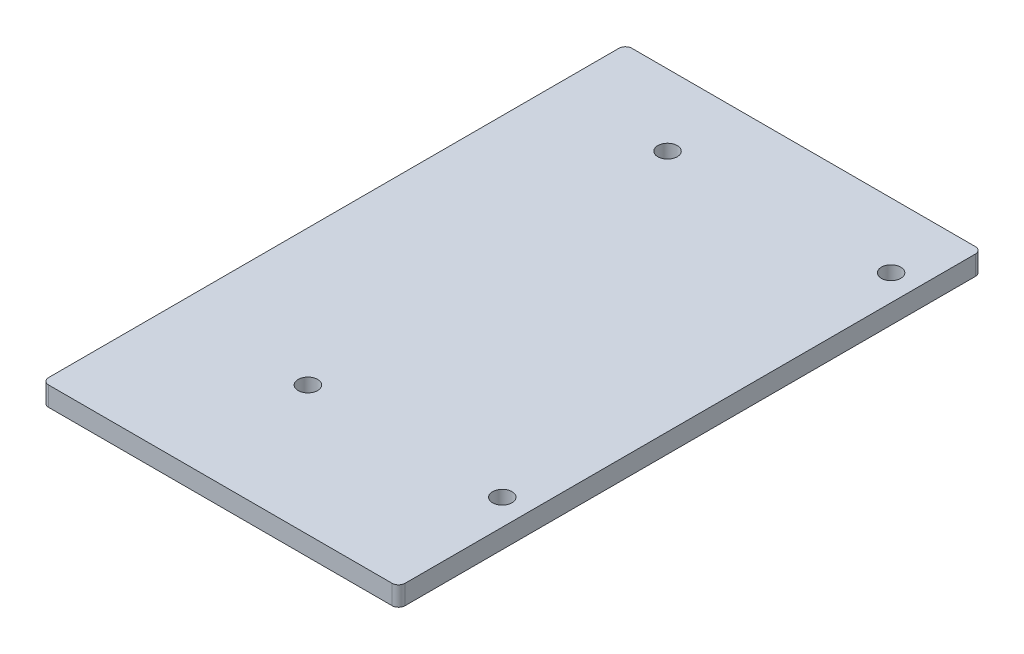
ISO-10303-21;
HEADER;
FILE_DESCRIPTION(('STEP AP214'),'2;1');
FILE_NAME('part.step','',(''),(''),'','','');
FILE_SCHEMA(('AUTOMOTIVE_DESIGN { 1 0 10303 214 1 1 1 1 }'));
ENDSEC;
DATA;
#1=APPLICATION_CONTEXT('core data for automotive mechanical design processes');
#2=APPLICATION_PROTOCOL_DEFINITION('international standard','automotive_design',2000,#1);
#3=PRODUCT_CONTEXT('',#1,'mechanical');
#4=PRODUCT('Part','Part','',(#3));
#5=PRODUCT_RELATED_PRODUCT_CATEGORY('part','',(#4));
#6=PRODUCT_DEFINITION_FORMATION('','',#4);
#7=PRODUCT_DEFINITION_CONTEXT('part definition',#1,'design');
#8=PRODUCT_DEFINITION('design','',#6,#7);
#9=PRODUCT_DEFINITION_SHAPE('','',#8);
#10=(LENGTH_UNIT() NAMED_UNIT(*) SI_UNIT(.MILLI.,.METRE.));
#11=(NAMED_UNIT(*) PLANE_ANGLE_UNIT() SI_UNIT($,.RADIAN.));
#12=(NAMED_UNIT(*) SI_UNIT($,.STERADIAN.) SOLID_ANGLE_UNIT());
#13=UNCERTAINTY_MEASURE_WITH_UNIT(LENGTH_MEASURE(1.E-05),#10,'distance_accuracy_value','');
#14=(GEOMETRIC_REPRESENTATION_CONTEXT(3) GLOBAL_UNCERTAINTY_ASSIGNED_CONTEXT((#13)) GLOBAL_UNIT_ASSIGNED_CONTEXT((#10,
#11,#12)) REPRESENTATION_CONTEXT('',''));
#15=CARTESIAN_POINT('',(0.,0.,0.));
#16=DIRECTION('',(0.,0.,1.));
#17=DIRECTION('',(1.,0.,0.));
#18=AXIS2_PLACEMENT_3D('',#15,#16,#17);
#19=CARTESIAN_POINT('',(0.,3.,0.));
#20=DIRECTION('',(0.,1.,0.));
#21=DIRECTION('',(0.,0.,1.));
#22=AXIS2_PLACEMENT_3D('',#19,#20,#21);
#23=PLANE('',#22);
#24=CARTESIAN_POINT('',(21.,3.,70.));
#25=DIRECTION('',(0.,1.,0.));
#26=DIRECTION('',(0.,0.,1.));
#27=AXIS2_PLACEMENT_3D('',#24,#25,#26);
#28=CIRCLE('',#27,1.5);
#29=CARTESIAN_POINT('',(21.,3.,71.5));
#30=VERTEX_POINT('',#29);
#31=EDGE_CURVE('E189',#30,#30,#28,.T.);
#32=ORIENTED_EDGE('',*,*,#31,.F.);
#33=EDGE_LOOP('',(#32));
#34=FACE_BOUND('',#33,.T.);
#35=CARTESIAN_POINT('',(17.5,3.,11.));
#36=DIRECTION('',(0.,1.,0.));
#37=DIRECTION('',(0.,0.,1.));
#38=AXIS2_PLACEMENT_3D('',#35,#36,#37);
#39=CIRCLE('',#38,1.5);
#40=CARTESIAN_POINT('',(17.5,3.,12.5));
#41=VERTEX_POINT('',#40);
#42=EDGE_CURVE('E172',#41,#41,#39,.T.);
#43=ORIENTED_EDGE('',*,*,#42,.F.);
#44=EDGE_LOOP('',(#43));
#45=FACE_BOUND('',#44,.T.);
#46=DIRECTION('',(0.,0.,-1.));
#47=VECTOR('',#46,1.);
#48=CARTESIAN_POINT('',(55.,3.,0.));
#49=LINE('',#48,#47);
#50=CARTESIAN_POINT('',(55.,3.,89.));
#51=VERTEX_POINT('',#50);
#52=CARTESIAN_POINT('',(55.,3.,0.999999999999999));
#53=VERTEX_POINT('',#52);
#54=EDGE_CURVE('E179',#51,#53,#49,.T.);
#55=ORIENTED_EDGE('',*,*,#54,.T.);
#56=CARTESIAN_POINT('',(54.,3.,1.));
#57=DIRECTION('',(0.,1.,0.));
#58=DIRECTION('',(0.,0.,1.));
#59=AXIS2_PLACEMENT_3D('',#56,#57,#58);
#60=CIRCLE('',#59,1.);
#61=CARTESIAN_POINT('',(54.,3.,0.));
#62=VERTEX_POINT('',#61);
#63=EDGE_CURVE('E156',#53,#62,#60,.T.);
#64=ORIENTED_EDGE('',*,*,#63,.T.);
#65=DIRECTION('',(-1.,0.,0.));
#66=VECTOR('',#65,1.);
#67=CARTESIAN_POINT('',(0.,3.,0.));
#68=LINE('',#67,#66);
#69=CARTESIAN_POINT('',(1.,3.,0.));
#70=VERTEX_POINT('',#69);
#71=EDGE_CURVE('E127',#62,#70,#68,.T.);
#72=ORIENTED_EDGE('',*,*,#71,.T.);
#73=CARTESIAN_POINT('',(1.,3.,1.));
#74=DIRECTION('',(0.,1.,0.));
#75=DIRECTION('',(0.,0.,1.));
#76=AXIS2_PLACEMENT_3D('',#73,#74,#75);
#77=CIRCLE('',#76,1.);
#78=CARTESIAN_POINT('',(0.,3.,1.));
#79=VERTEX_POINT('',#78);
#80=EDGE_CURVE('E154',#70,#79,#77,.T.);
#81=ORIENTED_EDGE('',*,*,#80,.T.);
#82=DIRECTION('',(0.,0.,1.));
#83=VECTOR('',#82,1.);
#84=CARTESIAN_POINT('',(0.,3.,0.));
#85=LINE('',#84,#83);
#86=CARTESIAN_POINT('',(0.,3.,89.));
#87=VERTEX_POINT('',#86);
#88=EDGE_CURVE('E134',#79,#87,#85,.T.);
#89=ORIENTED_EDGE('',*,*,#88,.T.);
#90=CARTESIAN_POINT('',(1.00000000000001,3.,89.));
#91=DIRECTION('',(0.,1.,0.));
#92=DIRECTION('',(0.,0.,1.));
#93=AXIS2_PLACEMENT_3D('',#90,#91,#92);
#94=CIRCLE('',#93,1.);
#95=CARTESIAN_POINT('',(1.00000000000001,3.,90.));
#96=VERTEX_POINT('',#95);
#97=EDGE_CURVE('E62',#87,#96,#94,.T.);
#98=ORIENTED_EDGE('',*,*,#97,.T.);
#99=DIRECTION('',(1.,0.,0.));
#100=VECTOR('',#99,1.);
#101=CARTESIAN_POINT('',(0.,3.,90.));
#102=LINE('',#101,#100);
#103=CARTESIAN_POINT('',(54.,3.,90.));
#104=VERTEX_POINT('',#103);
#105=EDGE_CURVE('E137',#96,#104,#102,.T.);
#106=ORIENTED_EDGE('',*,*,#105,.T.);
#107=CARTESIAN_POINT('',(54.,3.,89.));
#108=DIRECTION('',(0.,1.,0.));
#109=DIRECTION('',(0.,0.,1.));
#110=AXIS2_PLACEMENT_3D('',#107,#108,#109);
#111=CIRCLE('',#110,1.);
#112=EDGE_CURVE('E151',#104,#51,#111,.T.);
#113=ORIENTED_EDGE('',*,*,#112,.T.);
#114=EDGE_LOOP('',(#55,#64,#72,#81,#89,#98,#106,#113));
#115=FACE_BOUND('',#114,.T.);
#116=CARTESIAN_POINT('',(51.,3.,10.));
#117=DIRECTION('',(0.,1.,0.));
#118=DIRECTION('',(0.,0.,1.));
#119=AXIS2_PLACEMENT_3D('',#116,#117,#118);
#120=CIRCLE('',#119,1.5);
#121=CARTESIAN_POINT('',(51.,3.,11.5));
#122=VERTEX_POINT('',#121);
#123=EDGE_CURVE('E184',#122,#122,#120,.T.);
#124=ORIENTED_EDGE('',*,*,#123,.F.);
#125=EDGE_LOOP('',(#124));
#126=FACE_BOUND('',#125,.T.);
#127=CARTESIAN_POINT('',(51.,3.,70.));
#128=DIRECTION('',(0.,1.,0.));
#129=DIRECTION('',(0.,0.,1.));
#130=AXIS2_PLACEMENT_3D('',#127,#128,#129);
#131=CIRCLE('',#130,1.5);
#132=CARTESIAN_POINT('',(51.,3.,71.5));
#133=VERTEX_POINT('',#132);
#134=EDGE_CURVE('E195',#133,#133,#131,.T.);
#135=ORIENTED_EDGE('',*,*,#134,.F.);
#136=EDGE_LOOP('',(#135));
#137=FACE_BOUND('',#136,.T.);
#138=ADVANCED_FACE('F41',(#34,#45,#115,#126,#137),#23,.T.);
#139=CARTESIAN_POINT('',(0.,0.,0.));
#140=DIRECTION('',(0.,1.,0.));
#141=DIRECTION('',(0.,0.,1.));
#142=AXIS2_PLACEMENT_3D('',#139,#140,#141);
#143=PLANE('',#142);
#144=DIRECTION('',(-1.,0.,0.));
#145=VECTOR('',#144,1.);
#146=CARTESIAN_POINT('',(0.,0.,0.));
#147=LINE('',#146,#145);
#148=CARTESIAN_POINT('',(54.,0.,0.));
#149=VERTEX_POINT('',#148);
#150=CARTESIAN_POINT('',(1.,0.,0.));
#151=VERTEX_POINT('',#150);
#152=EDGE_CURVE('E124',#149,#151,#147,.T.);
#153=ORIENTED_EDGE('',*,*,#152,.F.);
#154=CARTESIAN_POINT('',(54.,0.,1.));
#155=DIRECTION('',(0.,1.,0.));
#156=DIRECTION('',(0.,0.,1.));
#157=AXIS2_PLACEMENT_3D('',#154,#155,#156);
#158=CIRCLE('',#157,1.);
#159=CARTESIAN_POINT('',(55.,0.,0.999999999999999));
#160=VERTEX_POINT('',#159);
#161=EDGE_CURVE('E107',#149,#160,#158,.F.);
#162=ORIENTED_EDGE('',*,*,#161,.T.);
#163=DIRECTION('',(0.,0.,-1.));
#164=VECTOR('',#163,1.);
#165=CARTESIAN_POINT('',(55.,0.,0.));
#166=LINE('',#165,#164);
#167=CARTESIAN_POINT('',(55.,0.,89.));
#168=VERTEX_POINT('',#167);
#169=EDGE_CURVE('E135',#168,#160,#166,.T.);
#170=ORIENTED_EDGE('',*,*,#169,.F.);
#171=CARTESIAN_POINT('',(54.,0.,89.));
#172=DIRECTION('',(0.,1.,0.));
#173=DIRECTION('',(0.,0.,1.));
#174=AXIS2_PLACEMENT_3D('',#171,#172,#173);
#175=CIRCLE('',#174,1.);
#176=CARTESIAN_POINT('',(54.,0.,90.));
#177=VERTEX_POINT('',#176);
#178=EDGE_CURVE('E128',#168,#177,#175,.F.);
#179=ORIENTED_EDGE('',*,*,#178,.T.);
#180=DIRECTION('',(1.,0.,0.));
#181=VECTOR('',#180,1.);
#182=CARTESIAN_POINT('',(0.,0.,90.));
#183=LINE('',#182,#181);
#184=CARTESIAN_POINT('',(1.00000000000001,0.,90.));
#185=VERTEX_POINT('',#184);
#186=EDGE_CURVE('E139',#185,#177,#183,.T.);
#187=ORIENTED_EDGE('',*,*,#186,.F.);
#188=CARTESIAN_POINT('',(1.00000000000001,0.,89.));
#189=DIRECTION('',(0.,1.,0.));
#190=DIRECTION('',(0.,0.,1.));
#191=AXIS2_PLACEMENT_3D('',#188,#189,#190);
#192=CIRCLE('',#191,1.);
#193=CARTESIAN_POINT('',(0.,0.,89.));
#194=VERTEX_POINT('',#193);
#195=EDGE_CURVE('E145',#185,#194,#192,.F.);
#196=ORIENTED_EDGE('',*,*,#195,.T.);
#197=DIRECTION('',(0.,0.,1.));
#198=VECTOR('',#197,1.);
#199=CARTESIAN_POINT('',(0.,0.,0.));
#200=LINE('',#199,#198);
#201=CARTESIAN_POINT('',(0.,0.,1.));
#202=VERTEX_POINT('',#201);
#203=EDGE_CURVE('E167',#202,#194,#200,.T.);
#204=ORIENTED_EDGE('',*,*,#203,.F.);
#205=CARTESIAN_POINT('',(1.,0.,1.));
#206=DIRECTION('',(0.,1.,0.));
#207=DIRECTION('',(0.,0.,1.));
#208=AXIS2_PLACEMENT_3D('',#205,#206,#207);
#209=CIRCLE('',#208,1.);
#210=EDGE_CURVE('E118',#202,#151,#209,.F.);
#211=ORIENTED_EDGE('',*,*,#210,.T.);
#212=EDGE_LOOP('',(#153,#162,#170,#179,#187,#196,#204,#211));
#213=FACE_BOUND('',#212,.T.);
#214=CARTESIAN_POINT('',(17.5,0.,11.));
#215=DIRECTION('',(0.,1.,0.));
#216=DIRECTION('',(0.,0.,1.));
#217=AXIS2_PLACEMENT_3D('',#214,#215,#216);
#218=CIRCLE('',#217,1.5);
#219=CARTESIAN_POINT('',(17.5,0.,12.5));
#220=VERTEX_POINT('',#219);
#221=EDGE_CURVE('E175',#220,#220,#218,.T.);
#222=ORIENTED_EDGE('',*,*,#221,.T.);
#223=EDGE_LOOP('',(#222));
#224=FACE_BOUND('',#223,.T.);
#225=CARTESIAN_POINT('',(51.,0.,10.));
#226=DIRECTION('',(0.,1.,0.));
#227=DIRECTION('',(0.,0.,1.));
#228=AXIS2_PLACEMENT_3D('',#225,#226,#227);
#229=CIRCLE('',#228,1.5);
#230=CARTESIAN_POINT('',(51.,0.,11.5));
#231=VERTEX_POINT('',#230);
#232=EDGE_CURVE('E186',#231,#231,#229,.T.);
#233=ORIENTED_EDGE('',*,*,#232,.T.);
#234=EDGE_LOOP('',(#233));
#235=FACE_BOUND('',#234,.T.);
#236=CARTESIAN_POINT('',(21.,0.,70.));
#237=DIRECTION('',(0.,1.,0.));
#238=DIRECTION('',(0.,0.,1.));
#239=AXIS2_PLACEMENT_3D('',#236,#237,#238);
#240=CIRCLE('',#239,1.5);
#241=CARTESIAN_POINT('',(21.,0.,71.5));
#242=VERTEX_POINT('',#241);
#243=EDGE_CURVE('E192',#242,#242,#240,.T.);
#244=ORIENTED_EDGE('',*,*,#243,.T.);
#245=EDGE_LOOP('',(#244));
#246=FACE_BOUND('',#245,.T.);
#247=CARTESIAN_POINT('',(51.,0.,70.));
#248=DIRECTION('',(0.,1.,0.));
#249=DIRECTION('',(0.,0.,1.));
#250=AXIS2_PLACEMENT_3D('',#247,#248,#249);
#251=CIRCLE('',#250,1.5);
#252=CARTESIAN_POINT('',(51.,0.,71.5));
#253=VERTEX_POINT('',#252);
#254=EDGE_CURVE('E198',#253,#253,#251,.T.);
#255=ORIENTED_EDGE('',*,*,#254,.T.);
#256=EDGE_LOOP('',(#255));
#257=FACE_BOUND('',#256,.T.);
#258=ADVANCED_FACE('F131',(#213,#224,#235,#246,#257),#143,.F.);
#259=CARTESIAN_POINT('',(0.,3.,0.));
#260=DIRECTION('',(1.,0.,0.));
#261=DIRECTION('',(0.,0.,-1.));
#262=AXIS2_PLACEMENT_3D('',#259,#260,#261);
#263=PLANE('',#262);
#264=ORIENTED_EDGE('',*,*,#88,.F.);
#265=DIRECTION('',(0.,-1.,0.));
#266=VECTOR('',#265,1.);
#267=CARTESIAN_POINT('',(0.,3.,1.));
#268=LINE('',#267,#266);
#269=EDGE_CURVE('E160',#79,#202,#268,.T.);
#270=ORIENTED_EDGE('',*,*,#269,.T.);
#271=ORIENTED_EDGE('',*,*,#203,.T.);
#272=DIRECTION('',(0.,-1.,0.));
#273=VECTOR('',#272,1.);
#274=CARTESIAN_POINT('',(0.,3.,89.));
#275=LINE('',#274,#273);
#276=EDGE_CURVE('E158',#194,#87,#275,.F.);
#277=ORIENTED_EDGE('',*,*,#276,.T.);
#278=EDGE_LOOP('',(#264,#270,#271,#277));
#279=FACE_BOUND('',#278,.T.);
#280=ADVANCED_FACE('F166',(#279),#263,.F.);
#281=CARTESIAN_POINT('',(0.,3.,90.));
#282=DIRECTION('',(0.,0.,-1.));
#283=DIRECTION('',(-1.,0.,0.));
#284=AXIS2_PLACEMENT_3D('',#281,#282,#283);
#285=PLANE('',#284);
#286=ORIENTED_EDGE('',*,*,#105,.F.);
#287=DIRECTION('',(0.,-1.,0.));
#288=VECTOR('',#287,1.);
#289=CARTESIAN_POINT('',(1.00000000000001,3.,90.));
#290=LINE('',#289,#288);
#291=EDGE_CURVE('E11',#96,#185,#290,.T.);
#292=ORIENTED_EDGE('',*,*,#291,.T.);
#293=ORIENTED_EDGE('',*,*,#186,.T.);
#294=DIRECTION('',(0.,-1.,0.));
#295=VECTOR('',#294,1.);
#296=CARTESIAN_POINT('',(54.,3.,90.));
#297=LINE('',#296,#295);
#298=EDGE_CURVE('E49',#177,#104,#297,.F.);
#299=ORIENTED_EDGE('',*,*,#298,.T.);
#300=EDGE_LOOP('',(#286,#292,#293,#299));
#301=FACE_BOUND('',#300,.T.);
#302=ADVANCED_FACE('F226',(#301),#285,.F.);
#303=CARTESIAN_POINT('',(55.,3.,0.));
#304=DIRECTION('',(-1.,0.,0.));
#305=DIRECTION('',(0.,0.,1.));
#306=AXIS2_PLACEMENT_3D('',#303,#304,#305);
#307=PLANE('',#306);
#308=ORIENTED_EDGE('',*,*,#169,.T.);
#309=DIRECTION('',(0.,-1.,0.));
#310=VECTOR('',#309,1.);
#311=CARTESIAN_POINT('',(55.,3.,1.));
#312=LINE('',#311,#310);
#313=EDGE_CURVE('E112',#160,#53,#312,.F.);
#314=ORIENTED_EDGE('',*,*,#313,.T.);
#315=ORIENTED_EDGE('',*,*,#54,.F.);
#316=DIRECTION('',(0.,-1.,0.));
#317=VECTOR('',#316,1.);
#318=CARTESIAN_POINT('',(55.,3.,89.));
#319=LINE('',#318,#317);
#320=EDGE_CURVE('E117',#51,#168,#319,.T.);
#321=ORIENTED_EDGE('',*,*,#320,.T.);
#322=EDGE_LOOP('',(#308,#314,#315,#321));
#323=FACE_BOUND('',#322,.T.);
#324=ADVANCED_FACE('F223',(#323),#307,.F.);
#325=CARTESIAN_POINT('',(0.,3.,0.));
#326=DIRECTION('',(0.,0.,1.));
#327=DIRECTION('',(1.,0.,0.));
#328=AXIS2_PLACEMENT_3D('',#325,#326,#327);
#329=PLANE('',#328);
#330=ORIENTED_EDGE('',*,*,#71,.F.);
#331=DIRECTION('',(0.,-1.,0.));
#332=VECTOR('',#331,1.);
#333=CARTESIAN_POINT('',(54.,3.,0.));
#334=LINE('',#333,#332);
#335=EDGE_CURVE('E111',#62,#149,#334,.T.);
#336=ORIENTED_EDGE('',*,*,#335,.T.);
#337=ORIENTED_EDGE('',*,*,#152,.T.);
#338=DIRECTION('',(0.,-1.,0.));
#339=VECTOR('',#338,1.);
#340=CARTESIAN_POINT('',(1.,3.,0.));
#341=LINE('',#340,#339);
#342=EDGE_CURVE('E129',#151,#70,#341,.F.);
#343=ORIENTED_EDGE('',*,*,#342,.T.);
#344=EDGE_LOOP('',(#330,#336,#337,#343));
#345=FACE_BOUND('',#344,.T.);
#346=ADVANCED_FACE('F123',(#345),#329,.F.);
#347=CARTESIAN_POINT('',(17.5,3.,11.));
#348=DIRECTION('',(0.,-1.,0.));
#349=DIRECTION('',(0.,0.,-1.));
#350=AXIS2_PLACEMENT_3D('',#347,#348,#349);
#351=CYLINDRICAL_SURFACE('',#350,1.5);
#352=ORIENTED_EDGE('',*,*,#42,.T.);
#353=EDGE_LOOP('',(#352));
#354=FACE_BOUND('',#353,.T.);
#355=ORIENTED_EDGE('',*,*,#221,.F.);
#356=EDGE_LOOP('',(#355));
#357=FACE_BOUND('',#356,.T.);
#358=ADVANCED_FACE('F218',(#354,#357),#351,.F.);
#359=CARTESIAN_POINT('',(51.,3.,10.));
#360=DIRECTION('',(0.,-1.,0.));
#361=DIRECTION('',(0.,0.,-1.));
#362=AXIS2_PLACEMENT_3D('',#359,#360,#361);
#363=CYLINDRICAL_SURFACE('',#362,1.5);
#364=ORIENTED_EDGE('',*,*,#123,.T.);
#365=EDGE_LOOP('',(#364));
#366=FACE_BOUND('',#365,.T.);
#367=ORIENTED_EDGE('',*,*,#232,.F.);
#368=EDGE_LOOP('',(#367));
#369=FACE_BOUND('',#368,.T.);
#370=ADVANCED_FACE('F250',(#366,#369),#363,.F.);
#371=CARTESIAN_POINT('',(21.,3.,70.));
#372=DIRECTION('',(0.,-1.,0.));
#373=DIRECTION('',(0.,0.,-1.));
#374=AXIS2_PLACEMENT_3D('',#371,#372,#373);
#375=CYLINDRICAL_SURFACE('',#374,1.5);
#376=ORIENTED_EDGE('',*,*,#31,.T.);
#377=EDGE_LOOP('',(#376));
#378=FACE_BOUND('',#377,.T.);
#379=ORIENTED_EDGE('',*,*,#243,.F.);
#380=EDGE_LOOP('',(#379));
#381=FACE_BOUND('',#380,.T.);
#382=ADVANCED_FACE('F253',(#378,#381),#375,.F.);
#383=CARTESIAN_POINT('',(51.,3.,70.));
#384=DIRECTION('',(0.,-1.,0.));
#385=DIRECTION('',(0.,0.,-1.));
#386=AXIS2_PLACEMENT_3D('',#383,#384,#385);
#387=CYLINDRICAL_SURFACE('',#386,1.5);
#388=ORIENTED_EDGE('',*,*,#134,.T.);
#389=EDGE_LOOP('',(#388));
#390=FACE_BOUND('',#389,.T.);
#391=ORIENTED_EDGE('',*,*,#254,.F.);
#392=EDGE_LOOP('',(#391));
#393=FACE_BOUND('',#392,.T.);
#394=ADVANCED_FACE('F204',(#390,#393),#387,.F.);
#395=CARTESIAN_POINT('',(54.,3.,1.));
#396=DIRECTION('',(0.,-1.,0.));
#397=DIRECTION('',(0.,0.,-1.));
#398=AXIS2_PLACEMENT_3D('',#395,#396,#397);
#399=CYLINDRICAL_SURFACE('',#398,1.);
#400=ORIENTED_EDGE('',*,*,#63,.F.);
#401=ORIENTED_EDGE('',*,*,#313,.F.);
#402=ORIENTED_EDGE('',*,*,#161,.F.);
#403=ORIENTED_EDGE('',*,*,#335,.F.);
#404=EDGE_LOOP('',(#400,#401,#402,#403));
#405=FACE_BOUND('',#404,.T.);
#406=ADVANCED_FACE('F110',(#405),#399,.T.);
#407=CARTESIAN_POINT('',(1.,3.,1.));
#408=DIRECTION('',(0.,-1.,0.));
#409=DIRECTION('',(0.,0.,-1.));
#410=AXIS2_PLACEMENT_3D('',#407,#408,#409);
#411=CYLINDRICAL_SURFACE('',#410,1.);
#412=ORIENTED_EDGE('',*,*,#80,.F.);
#413=ORIENTED_EDGE('',*,*,#342,.F.);
#414=ORIENTED_EDGE('',*,*,#210,.F.);
#415=ORIENTED_EDGE('',*,*,#269,.F.);
#416=EDGE_LOOP('',(#412,#413,#414,#415));
#417=FACE_BOUND('',#416,.T.);
#418=ADVANCED_FACE('F234',(#417),#411,.T.);
#419=CARTESIAN_POINT('',(1.00000000000001,3.,89.));
#420=DIRECTION('',(0.,-1.,0.));
#421=DIRECTION('',(0.,0.,-1.));
#422=AXIS2_PLACEMENT_3D('',#419,#420,#421);
#423=CYLINDRICAL_SURFACE('',#422,1.);
#424=ORIENTED_EDGE('',*,*,#97,.F.);
#425=ORIENTED_EDGE('',*,*,#276,.F.);
#426=ORIENTED_EDGE('',*,*,#195,.F.);
#427=ORIENTED_EDGE('',*,*,#291,.F.);
#428=EDGE_LOOP('',(#424,#425,#426,#427));
#429=FACE_BOUND('',#428,.T.);
#430=ADVANCED_FACE('F236',(#429),#423,.T.);
#431=CARTESIAN_POINT('',(54.,3.,89.));
#432=DIRECTION('',(0.,-1.,0.));
#433=DIRECTION('',(0.,0.,-1.));
#434=AXIS2_PLACEMENT_3D('',#431,#432,#433);
#435=CYLINDRICAL_SURFACE('',#434,1.);
#436=ORIENTED_EDGE('',*,*,#112,.F.);
#437=ORIENTED_EDGE('',*,*,#298,.F.);
#438=ORIENTED_EDGE('',*,*,#178,.F.);
#439=ORIENTED_EDGE('',*,*,#320,.F.);
#440=EDGE_LOOP('',(#436,#437,#438,#439));
#441=FACE_BOUND('',#440,.T.);
#442=ADVANCED_FACE('F43',(#441),#435,.T.);
#443=CLOSED_SHELL('',(#138,#258,#280,#302,#324,#346,#358,#370,#382,#394,#406,#418,#430,#442));
#444=MANIFOLD_SOLID_BREP('B2',#443);
#445=ADVANCED_BREP_SHAPE_REPRESENTATION('',(#18,#444),#14);
#446=SHAPE_DEFINITION_REPRESENTATION(#9,#445);
ENDSEC;
END-ISO-10303-21;
